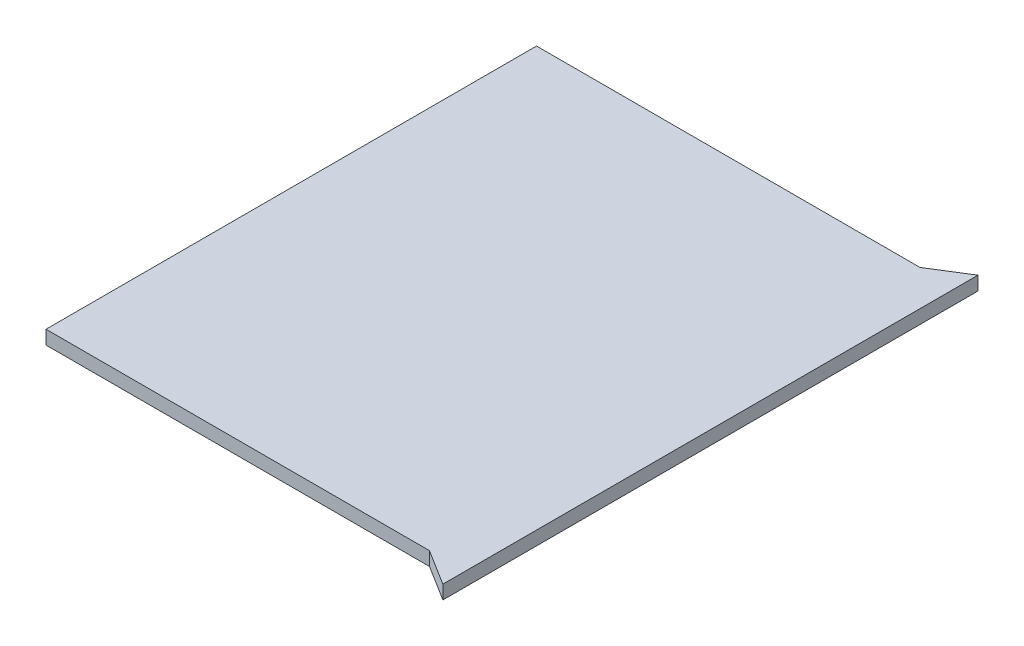
ISO-10303-21;
HEADER;
FILE_DESCRIPTION(('STEP AP214'),'2;1');
FILE_NAME('part.step','',(''),(''),'','','');
FILE_SCHEMA(('AUTOMOTIVE_DESIGN { 1 0 10303 214 1 1 1 1 }'));
ENDSEC;
DATA;
#1=APPLICATION_CONTEXT('core data for automotive mechanical design processes');
#2=APPLICATION_PROTOCOL_DEFINITION('international standard','automotive_design',2000,#1);
#3=PRODUCT_CONTEXT('',#1,'mechanical');
#4=PRODUCT('Part','Part','',(#3));
#5=PRODUCT_RELATED_PRODUCT_CATEGORY('part','',(#4));
#6=PRODUCT_DEFINITION_FORMATION('','',#4);
#7=PRODUCT_DEFINITION_CONTEXT('part definition',#1,'design');
#8=PRODUCT_DEFINITION('design','',#6,#7);
#9=PRODUCT_DEFINITION_SHAPE('','',#8);
#10=(LENGTH_UNIT() NAMED_UNIT(*) SI_UNIT(.MILLI.,.METRE.));
#11=(NAMED_UNIT(*) PLANE_ANGLE_UNIT() SI_UNIT($,.RADIAN.));
#12=(NAMED_UNIT(*) SI_UNIT($,.STERADIAN.) SOLID_ANGLE_UNIT());
#13=UNCERTAINTY_MEASURE_WITH_UNIT(LENGTH_MEASURE(1.E-05),#10,'distance_accuracy_value','');
#14=(GEOMETRIC_REPRESENTATION_CONTEXT(3) GLOBAL_UNCERTAINTY_ASSIGNED_CONTEXT((#13)) GLOBAL_UNIT_ASSIGNED_CONTEXT((#10,
#11,#12)) REPRESENTATION_CONTEXT('',''));
#15=CARTESIAN_POINT('',(0.,0.,0.));
#16=DIRECTION('',(0.,0.,1.));
#17=DIRECTION('',(1.,0.,0.));
#18=AXIS2_PLACEMENT_3D('',#15,#16,#17);
#19=CARTESIAN_POINT('',(-21.5000000000001,1.54,27.5));
#20=DIRECTION('',(-1.,0.,0.));
#21=DIRECTION('',(0.,0.,1.));
#22=AXIS2_PLACEMENT_3D('',#19,#20,#21);
#23=PLANE('',#22);
#24=DIRECTION('',(0.,0.,-1.));
#25=VECTOR('',#24,1.);
#26=CARTESIAN_POINT('',(-21.5000000000001,0.,27.5));
#27=LINE('',#26,#25);
#28=CARTESIAN_POINT('',(-21.5000000000001,0.,27.5));
#29=VERTEX_POINT('',#28);
#30=CARTESIAN_POINT('',(-21.5000000000001,0.,-27.5));
#31=VERTEX_POINT('',#30);
#32=EDGE_CURVE('E124',#29,#31,#27,.T.);
#33=ORIENTED_EDGE('',*,*,#32,.F.);
#34=DIRECTION('',(0.,-1.,0.));
#35=VECTOR('',#34,1.);
#36=CARTESIAN_POINT('',(-21.5000000000001,1.54,27.5));
#37=LINE('',#36,#35);
#38=CARTESIAN_POINT('',(-21.5000000000001,1.54,27.5));
#39=VERTEX_POINT('',#38);
#40=EDGE_CURVE('E11',#39,#29,#37,.T.);
#41=ORIENTED_EDGE('',*,*,#40,.F.);
#42=DIRECTION('',(0.,0.,-1.));
#43=VECTOR('',#42,1.);
#44=CARTESIAN_POINT('',(-21.5000000000001,1.54,27.5));
#45=LINE('',#44,#43);
#46=CARTESIAN_POINT('',(-21.5000000000001,1.54,-27.5));
#47=VERTEX_POINT('',#46);
#48=EDGE_CURVE('E136',#39,#47,#45,.T.);
#49=ORIENTED_EDGE('',*,*,#48,.T.);
#50=DIRECTION('',(0.,-1.,0.));
#51=VECTOR('',#50,1.);
#52=CARTESIAN_POINT('',(-21.5000000000001,1.54,-27.5));
#53=LINE('',#52,#51);
#54=EDGE_CURVE('E40',#47,#31,#53,.T.);
#55=ORIENTED_EDGE('',*,*,#54,.T.);
#56=EDGE_LOOP('',(#33,#41,#49,#55));
#57=FACE_BOUND('',#56,.T.);
#58=ADVANCED_FACE('F37',(#57),#23,.T.);
#59=CARTESIAN_POINT('',(-21.5000000000001,1.54,27.5));
#60=DIRECTION('',(0.,0.,-1.));
#61=DIRECTION('',(-1.,0.,0.));
#62=AXIS2_PLACEMENT_3D('',#59,#60,#61);
#63=PLANE('',#62);
#64=DIRECTION('',(1.,0.,0.));
#65=VECTOR('',#64,1.);
#66=CARTESIAN_POINT('',(-21.5000000000001,0.,27.5));
#67=LINE('',#66,#65);
#68=CARTESIAN_POINT('',(21.4999999999999,0.,27.5));
#69=VERTEX_POINT('',#68);
#70=EDGE_CURVE('E76',#29,#69,#67,.T.);
#71=ORIENTED_EDGE('',*,*,#70,.T.);
#72=DIRECTION('',(0.,-1.,0.));
#73=VECTOR('',#72,1.);
#74=CARTESIAN_POINT('',(21.4999999999999,1.54,27.5));
#75=LINE('',#74,#73);
#76=CARTESIAN_POINT('',(21.4999999999999,1.54,27.5));
#77=VERTEX_POINT('',#76);
#78=EDGE_CURVE('E46',#77,#69,#75,.T.);
#79=ORIENTED_EDGE('',*,*,#78,.F.);
#80=DIRECTION('',(1.,0.,0.));
#81=VECTOR('',#80,1.);
#82=CARTESIAN_POINT('',(-21.5000000000001,1.54,27.5));
#83=LINE('',#82,#81);
#84=EDGE_CURVE('E103',#39,#77,#83,.T.);
#85=ORIENTED_EDGE('',*,*,#84,.F.);
#86=ORIENTED_EDGE('',*,*,#40,.T.);
#87=EDGE_LOOP('',(#71,#79,#85,#86));
#88=FACE_BOUND('',#87,.T.);
#89=ADVANCED_FACE('F155',(#88),#63,.F.);
#90=CARTESIAN_POINT('',(21.4999999999999,1.54,27.5));
#91=DIRECTION('',(0.529998940003176,0.,-0.847998304005091));
#92=DIRECTION('',(-0.847998304005091,0.,-0.529998940003176));
#93=AXIS2_PLACEMENT_3D('',#90,#91,#92);
#94=PLANE('',#93);
#95=DIRECTION('',(0.847998304005091,0.,0.529998940003176));
#96=VECTOR('',#95,1.);
#97=CARTESIAN_POINT('',(21.4999999999999,0.,27.5));
#98=LINE('',#97,#96);
#99=CARTESIAN_POINT('',(25.4999999999999,0.,30.));
#100=VERTEX_POINT('',#99);
#101=EDGE_CURVE('E110',#69,#100,#98,.T.);
#102=ORIENTED_EDGE('',*,*,#101,.T.);
#103=DIRECTION('',(0.,-1.,0.));
#104=VECTOR('',#103,1.);
#105=CARTESIAN_POINT('',(25.4999999999999,1.54,30.));
#106=LINE('',#105,#104);
#107=CARTESIAN_POINT('',(25.4999999999999,1.54,30.));
#108=VERTEX_POINT('',#107);
#109=EDGE_CURVE('E107',#108,#100,#106,.T.);
#110=ORIENTED_EDGE('',*,*,#109,.F.);
#111=DIRECTION('',(0.847998304005091,0.,0.529998940003176));
#112=VECTOR('',#111,1.);
#113=CARTESIAN_POINT('',(21.4999999999999,1.54,27.5));
#114=LINE('',#113,#112);
#115=EDGE_CURVE('E95',#77,#108,#114,.T.);
#116=ORIENTED_EDGE('',*,*,#115,.F.);
#117=ORIENTED_EDGE('',*,*,#78,.T.);
#118=EDGE_LOOP('',(#102,#110,#116,#117));
#119=FACE_BOUND('',#118,.T.);
#120=ADVANCED_FACE('F108',(#119),#94,.F.);
#121=CARTESIAN_POINT('',(25.4999999999999,1.54,-30.));
#122=DIRECTION('',(1.,0.,0.));
#123=DIRECTION('',(0.,0.,-1.));
#124=AXIS2_PLACEMENT_3D('',#121,#122,#123);
#125=PLANE('',#124);
#126=DIRECTION('',(0.,0.,1.));
#127=VECTOR('',#126,1.);
#128=CARTESIAN_POINT('',(25.4999999999999,0.,-30.));
#129=LINE('',#128,#127);
#130=CARTESIAN_POINT('',(25.4999999999999,0.,-30.));
#131=VERTEX_POINT('',#130);
#132=EDGE_CURVE('E133',#131,#100,#129,.T.);
#133=ORIENTED_EDGE('',*,*,#132,.F.);
#134=DIRECTION('',(0.,-1.,0.));
#135=VECTOR('',#134,1.);
#136=CARTESIAN_POINT('',(25.4999999999999,1.54,-30.));
#137=LINE('',#136,#135);
#138=CARTESIAN_POINT('',(25.4999999999999,1.54,-30.));
#139=VERTEX_POINT('',#138);
#140=EDGE_CURVE('E114',#139,#131,#137,.T.);
#141=ORIENTED_EDGE('',*,*,#140,.F.);
#142=DIRECTION('',(0.,0.,1.));
#143=VECTOR('',#142,1.);
#144=CARTESIAN_POINT('',(25.4999999999999,1.54,-30.));
#145=LINE('',#144,#143);
#146=EDGE_CURVE('E101',#139,#108,#145,.T.);
#147=ORIENTED_EDGE('',*,*,#146,.T.);
#148=ORIENTED_EDGE('',*,*,#109,.T.);
#149=EDGE_LOOP('',(#133,#141,#147,#148));
#150=FACE_BOUND('',#149,.T.);
#151=ADVANCED_FACE('F116',(#150),#125,.T.);
#152=CARTESIAN_POINT('',(21.4999999999999,1.54,-27.5));
#153=DIRECTION('',(-0.529998940003186,0.,-0.847998304005084));
#154=DIRECTION('',(-0.847998304005084,0.,0.529998940003186));
#155=AXIS2_PLACEMENT_3D('',#152,#153,#154);
#156=PLANE('',#155);
#157=DIRECTION('',(0.847998304005084,0.,-0.529998940003186));
#158=VECTOR('',#157,1.);
#159=CARTESIAN_POINT('',(21.4999999999999,0.,-27.5));
#160=LINE('',#159,#158);
#161=CARTESIAN_POINT('',(21.4999999999999,0.,-27.5));
#162=VERTEX_POINT('',#161);
#163=EDGE_CURVE('E130',#162,#131,#160,.T.);
#164=ORIENTED_EDGE('',*,*,#163,.F.);
#165=DIRECTION('',(0.,-1.,0.));
#166=VECTOR('',#165,1.);
#167=CARTESIAN_POINT('',(21.4999999999999,1.54,-27.5));
#168=LINE('',#167,#166);
#169=CARTESIAN_POINT('',(21.4999999999999,1.54,-27.5));
#170=VERTEX_POINT('',#169);
#171=EDGE_CURVE('E139',#170,#162,#168,.T.);
#172=ORIENTED_EDGE('',*,*,#171,.F.);
#173=DIRECTION('',(0.847998304005084,0.,-0.529998940003186));
#174=VECTOR('',#173,1.);
#175=CARTESIAN_POINT('',(21.4999999999999,1.54,-27.5));
#176=LINE('',#175,#174);
#177=EDGE_CURVE('E117',#170,#139,#176,.T.);
#178=ORIENTED_EDGE('',*,*,#177,.T.);
#179=ORIENTED_EDGE('',*,*,#140,.T.);
#180=EDGE_LOOP('',(#164,#172,#178,#179));
#181=FACE_BOUND('',#180,.T.);
#182=ADVANCED_FACE('F145',(#181),#156,.T.);
#183=CARTESIAN_POINT('',(-21.5000000000001,1.54,-27.5));
#184=DIRECTION('',(0.,0.,-1.));
#185=DIRECTION('',(-1.,0.,0.));
#186=AXIS2_PLACEMENT_3D('',#183,#184,#185);
#187=PLANE('',#186);
#188=DIRECTION('',(1.,0.,0.));
#189=VECTOR('',#188,1.);
#190=CARTESIAN_POINT('',(-21.5000000000001,0.,-27.5));
#191=LINE('',#190,#189);
#192=EDGE_CURVE('E127',#31,#162,#191,.T.);
#193=ORIENTED_EDGE('',*,*,#192,.F.);
#194=ORIENTED_EDGE('',*,*,#54,.F.);
#195=DIRECTION('',(1.,0.,0.));
#196=VECTOR('',#195,1.);
#197=CARTESIAN_POINT('',(-21.5000000000001,1.54,-27.5));
#198=LINE('',#197,#196);
#199=EDGE_CURVE('E119',#47,#170,#198,.T.);
#200=ORIENTED_EDGE('',*,*,#199,.T.);
#201=ORIENTED_EDGE('',*,*,#171,.T.);
#202=EDGE_LOOP('',(#193,#194,#200,#201));
#203=FACE_BOUND('',#202,.T.);
#204=ADVANCED_FACE('F141',(#203),#187,.T.);
#205=CARTESIAN_POINT('',(0.,1.54,0.));
#206=DIRECTION('',(0.,-1.,0.));
#207=DIRECTION('',(0.,0.,-1.));
#208=AXIS2_PLACEMENT_3D('',#205,#206,#207);
#209=PLANE('',#208);
#210=ORIENTED_EDGE('',*,*,#48,.F.);
#211=ORIENTED_EDGE('',*,*,#84,.T.);
#212=ORIENTED_EDGE('',*,*,#115,.T.);
#213=ORIENTED_EDGE('',*,*,#146,.F.);
#214=ORIENTED_EDGE('',*,*,#177,.F.);
#215=ORIENTED_EDGE('',*,*,#199,.F.);
#216=EDGE_LOOP('',(#210,#211,#212,#213,#214,#215));
#217=FACE_BOUND('',#216,.T.);
#218=ADVANCED_FACE('F98',(#217),#209,.F.);
#219=CARTESIAN_POINT('',(0.,0.,0.));
#220=DIRECTION('',(0.,-1.,0.));
#221=DIRECTION('',(0.,0.,-1.));
#222=AXIS2_PLACEMENT_3D('',#219,#220,#221);
#223=PLANE('',#222);
#224=ORIENTED_EDGE('',*,*,#32,.T.);
#225=ORIENTED_EDGE('',*,*,#192,.T.);
#226=ORIENTED_EDGE('',*,*,#163,.T.);
#227=ORIENTED_EDGE('',*,*,#132,.T.);
#228=ORIENTED_EDGE('',*,*,#101,.F.);
#229=ORIENTED_EDGE('',*,*,#70,.F.);
#230=EDGE_LOOP('',(#224,#225,#226,#227,#228,#229));
#231=FACE_BOUND('',#230,.T.);
#232=ADVANCED_FACE('F143',(#231),#223,.T.);
#233=CLOSED_SHELL('',(#58,#89,#120,#151,#182,#204,#218,#232));
#234=MANIFOLD_SOLID_BREP('B2',#233);
#235=ADVANCED_BREP_SHAPE_REPRESENTATION('',(#18,#234),#14);
#236=SHAPE_DEFINITION_REPRESENTATION(#9,#235);
ENDSEC;
END-ISO-10303-21;
